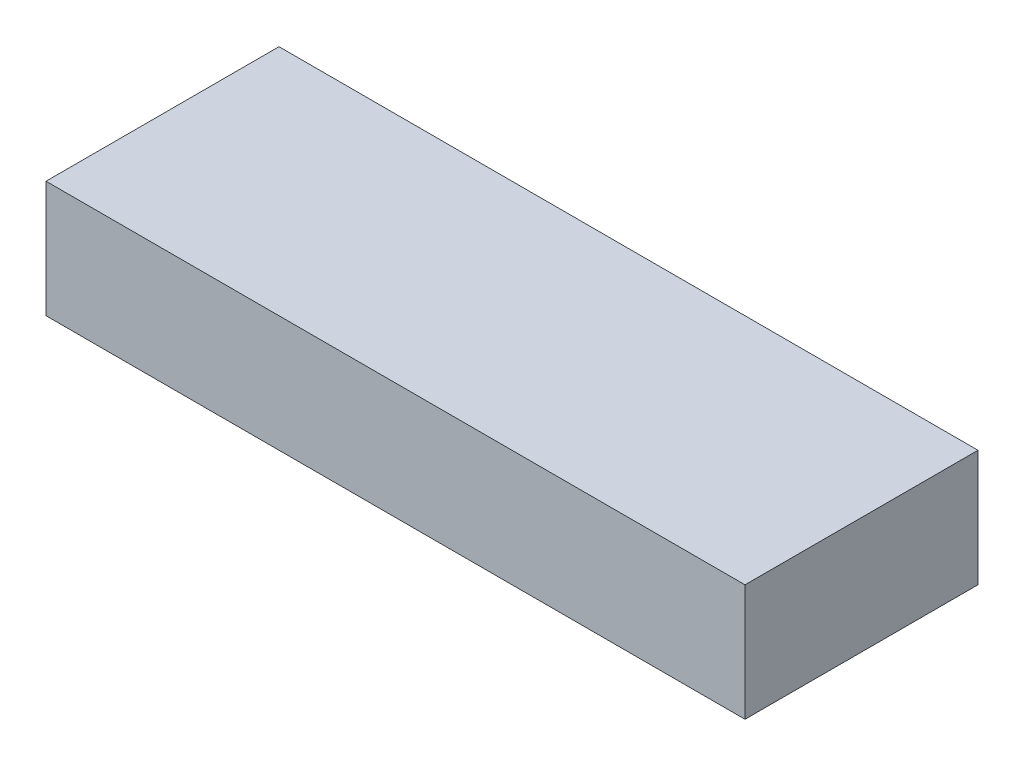
ISO-10303-21;
HEADER;
FILE_DESCRIPTION(('STEP AP214'),'2;1');
FILE_NAME('part.step','',(''),(''),'','','');
FILE_SCHEMA(('AUTOMOTIVE_DESIGN { 1 0 10303 214 1 1 1 1 }'));
ENDSEC;
DATA;
#1=APPLICATION_CONTEXT('core data for automotive mechanical design processes');
#2=APPLICATION_PROTOCOL_DEFINITION('international standard','automotive_design',2000,#1);
#3=PRODUCT_CONTEXT('',#1,'mechanical');
#4=PRODUCT('Part','Part','',(#3));
#5=PRODUCT_RELATED_PRODUCT_CATEGORY('part','',(#4));
#6=PRODUCT_DEFINITION_FORMATION('','',#4);
#7=PRODUCT_DEFINITION_CONTEXT('part definition',#1,'design');
#8=PRODUCT_DEFINITION('design','',#6,#7);
#9=PRODUCT_DEFINITION_SHAPE('','',#8);
#10=(LENGTH_UNIT() NAMED_UNIT(*) SI_UNIT(.MILLI.,.METRE.));
#11=(NAMED_UNIT(*) PLANE_ANGLE_UNIT() SI_UNIT($,.RADIAN.));
#12=(NAMED_UNIT(*) SI_UNIT($,.STERADIAN.) SOLID_ANGLE_UNIT());
#13=UNCERTAINTY_MEASURE_WITH_UNIT(LENGTH_MEASURE(1.E-05),#10,'distance_accuracy_value','');
#14=(GEOMETRIC_REPRESENTATION_CONTEXT(3) GLOBAL_UNCERTAINTY_ASSIGNED_CONTEXT((#13)) GLOBAL_UNIT_ASSIGNED_CONTEXT((#10,
#11,#12)) REPRESENTATION_CONTEXT('',''));
#15=CARTESIAN_POINT('',(0.,0.,0.));
#16=DIRECTION('',(0.,0.,1.));
#17=DIRECTION('',(1.,0.,0.));
#18=AXIS2_PLACEMENT_3D('',#15,#16,#17);
#19=CARTESIAN_POINT('',(1500.,500.,500.));
#20=DIRECTION('',(-1.,0.,0.));
#21=DIRECTION('',(0.,0.,1.));
#22=AXIS2_PLACEMENT_3D('',#19,#20,#21);
#23=PLANE('',#22);
#24=DIRECTION('',(0.,0.,-1.));
#25=VECTOR('',#24,1.);
#26=CARTESIAN_POINT('',(1500.,0.,500.));
#27=LINE('',#26,#25);
#28=CARTESIAN_POINT('',(1500.,0.,500.));
#29=VERTEX_POINT('',#28);
#30=CARTESIAN_POINT('',(1500.,0.,-500.));
#31=VERTEX_POINT('',#30);
#32=EDGE_CURVE('E98',#29,#31,#27,.T.);
#33=ORIENTED_EDGE('',*,*,#32,.T.);
#34=DIRECTION('',(0.,-1.,0.));
#35=VECTOR('',#34,1.);
#36=CARTESIAN_POINT('',(1500.,500.,-500.));
#37=LINE('',#36,#35);
#38=CARTESIAN_POINT('',(1500.,500.,-500.));
#39=VERTEX_POINT('',#38);
#40=EDGE_CURVE('E11',#39,#31,#37,.T.);
#41=ORIENTED_EDGE('',*,*,#40,.F.);
#42=DIRECTION('',(0.,0.,-1.));
#43=VECTOR('',#42,1.);
#44=CARTESIAN_POINT('',(1500.,500.,500.));
#45=LINE('',#44,#43);
#46=CARTESIAN_POINT('',(1500.,500.,500.));
#47=VERTEX_POINT('',#46);
#48=EDGE_CURVE('E84',#47,#39,#45,.T.);
#49=ORIENTED_EDGE('',*,*,#48,.F.);
#50=DIRECTION('',(0.,-1.,0.));
#51=VECTOR('',#50,1.);
#52=CARTESIAN_POINT('',(1500.,500.,500.));
#53=LINE('',#52,#51);
#54=EDGE_CURVE('E51',#47,#29,#53,.T.);
#55=ORIENTED_EDGE('',*,*,#54,.T.);
#56=EDGE_LOOP('',(#33,#41,#49,#55));
#57=FACE_BOUND('',#56,.T.);
#58=ADVANCED_FACE('F35',(#57),#23,.F.);
#59=CARTESIAN_POINT('',(1500.,500.,-500.));
#60=DIRECTION('',(0.,0.,1.));
#61=DIRECTION('',(1.,0.,0.));
#62=AXIS2_PLACEMENT_3D('',#59,#60,#61);
#63=PLANE('',#62);
#64=DIRECTION('',(-1.,0.,0.));
#65=VECTOR('',#64,1.);
#66=CARTESIAN_POINT('',(1500.,0.,-500.));
#67=LINE('',#66,#65);
#68=CARTESIAN_POINT('',(-1500.,0.,-500.));
#69=VERTEX_POINT('',#68);
#70=EDGE_CURVE('E89',#31,#69,#67,.T.);
#71=ORIENTED_EDGE('',*,*,#70,.T.);
#72=DIRECTION('',(0.,-1.,0.));
#73=VECTOR('',#72,1.);
#74=CARTESIAN_POINT('',(-1500.,500.,-500.));
#75=LINE('',#74,#73);
#76=CARTESIAN_POINT('',(-1500.,500.,-500.));
#77=VERTEX_POINT('',#76);
#78=EDGE_CURVE('E43',#77,#69,#75,.T.);
#79=ORIENTED_EDGE('',*,*,#78,.F.);
#80=DIRECTION('',(-1.,0.,0.));
#81=VECTOR('',#80,1.);
#82=CARTESIAN_POINT('',(1500.,500.,-500.));
#83=LINE('',#82,#81);
#84=EDGE_CURVE('E76',#39,#77,#83,.T.);
#85=ORIENTED_EDGE('',*,*,#84,.F.);
#86=ORIENTED_EDGE('',*,*,#40,.T.);
#87=EDGE_LOOP('',(#71,#79,#85,#86));
#88=FACE_BOUND('',#87,.T.);
#89=ADVANCED_FACE('F88',(#88),#63,.F.);
#90=CARTESIAN_POINT('',(-1500.,500.,500.));
#91=DIRECTION('',(-1.,0.,0.));
#92=DIRECTION('',(0.,0.,1.));
#93=AXIS2_PLACEMENT_3D('',#90,#91,#92);
#94=PLANE('',#93);
#95=DIRECTION('',(0.,0.,-1.));
#96=VECTOR('',#95,1.);
#97=CARTESIAN_POINT('',(-1500.,0.,500.));
#98=LINE('',#97,#96);
#99=CARTESIAN_POINT('',(-1500.,0.,500.));
#100=VERTEX_POINT('',#99);
#101=EDGE_CURVE('E101',#100,#69,#98,.T.);
#102=ORIENTED_EDGE('',*,*,#101,.F.);
#103=DIRECTION('',(0.,-1.,0.));
#104=VECTOR('',#103,1.);
#105=CARTESIAN_POINT('',(-1500.,500.,500.));
#106=LINE('',#105,#104);
#107=CARTESIAN_POINT('',(-1500.,500.,500.));
#108=VERTEX_POINT('',#107);
#109=EDGE_CURVE('E65',#108,#100,#106,.T.);
#110=ORIENTED_EDGE('',*,*,#109,.F.);
#111=DIRECTION('',(0.,0.,-1.));
#112=VECTOR('',#111,1.);
#113=CARTESIAN_POINT('',(-1500.,500.,500.));
#114=LINE('',#113,#112);
#115=EDGE_CURVE('E83',#108,#77,#114,.T.);
#116=ORIENTED_EDGE('',*,*,#115,.T.);
#117=ORIENTED_EDGE('',*,*,#78,.T.);
#118=EDGE_LOOP('',(#102,#110,#116,#117));
#119=FACE_BOUND('',#118,.T.);
#120=ADVANCED_FACE('F92',(#119),#94,.T.);
#121=CARTESIAN_POINT('',(1500.,500.,500.));
#122=DIRECTION('',(0.,0.,1.));
#123=DIRECTION('',(1.,0.,0.));
#124=AXIS2_PLACEMENT_3D('',#121,#122,#123);
#125=PLANE('',#124);
#126=DIRECTION('',(-1.,0.,0.));
#127=VECTOR('',#126,1.);
#128=CARTESIAN_POINT('',(1500.,0.,500.));
#129=LINE('',#128,#127);
#130=EDGE_CURVE('E103',#29,#100,#129,.T.);
#131=ORIENTED_EDGE('',*,*,#130,.F.);
#132=ORIENTED_EDGE('',*,*,#54,.F.);
#133=DIRECTION('',(-1.,0.,0.));
#134=VECTOR('',#133,1.);
#135=CARTESIAN_POINT('',(1500.,500.,500.));
#136=LINE('',#135,#134);
#137=EDGE_CURVE('E93',#47,#108,#136,.T.);
#138=ORIENTED_EDGE('',*,*,#137,.T.);
#139=ORIENTED_EDGE('',*,*,#109,.T.);
#140=EDGE_LOOP('',(#131,#132,#138,#139));
#141=FACE_BOUND('',#140,.T.);
#142=ADVANCED_FACE('F109',(#141),#125,.T.);
#143=CARTESIAN_POINT('',(0.,500.,0.));
#144=DIRECTION('',(0.,1.,0.));
#145=DIRECTION('',(0.,0.,1.));
#146=AXIS2_PLACEMENT_3D('',#143,#144,#145);
#147=PLANE('',#146);
#148=ORIENTED_EDGE('',*,*,#48,.T.);
#149=ORIENTED_EDGE('',*,*,#84,.T.);
#150=ORIENTED_EDGE('',*,*,#115,.F.);
#151=ORIENTED_EDGE('',*,*,#137,.F.);
#152=EDGE_LOOP('',(#148,#149,#150,#151));
#153=FACE_BOUND('',#152,.T.);
#154=ADVANCED_FACE('F80',(#153),#147,.T.);
#155=CARTESIAN_POINT('',(0.,0.,0.));
#156=DIRECTION('',(0.,1.,0.));
#157=DIRECTION('',(0.,0.,1.));
#158=AXIS2_PLACEMENT_3D('',#155,#156,#157);
#159=PLANE('',#158);
#160=ORIENTED_EDGE('',*,*,#32,.F.);
#161=ORIENTED_EDGE('',*,*,#130,.T.);
#162=ORIENTED_EDGE('',*,*,#101,.T.);
#163=ORIENTED_EDGE('',*,*,#70,.F.);
#164=EDGE_LOOP('',(#160,#161,#162,#163));
#165=FACE_BOUND('',#164,.T.);
#166=ADVANCED_FACE('F108',(#165),#159,.F.);
#167=CLOSED_SHELL('',(#58,#89,#120,#142,#154,#166));
#168=MANIFOLD_SOLID_BREP('B2',#167);
#169=ADVANCED_BREP_SHAPE_REPRESENTATION('',(#18,#168),#14);
#170=SHAPE_DEFINITION_REPRESENTATION(#9,#169);
ENDSEC;
END-ISO-10303-21;
